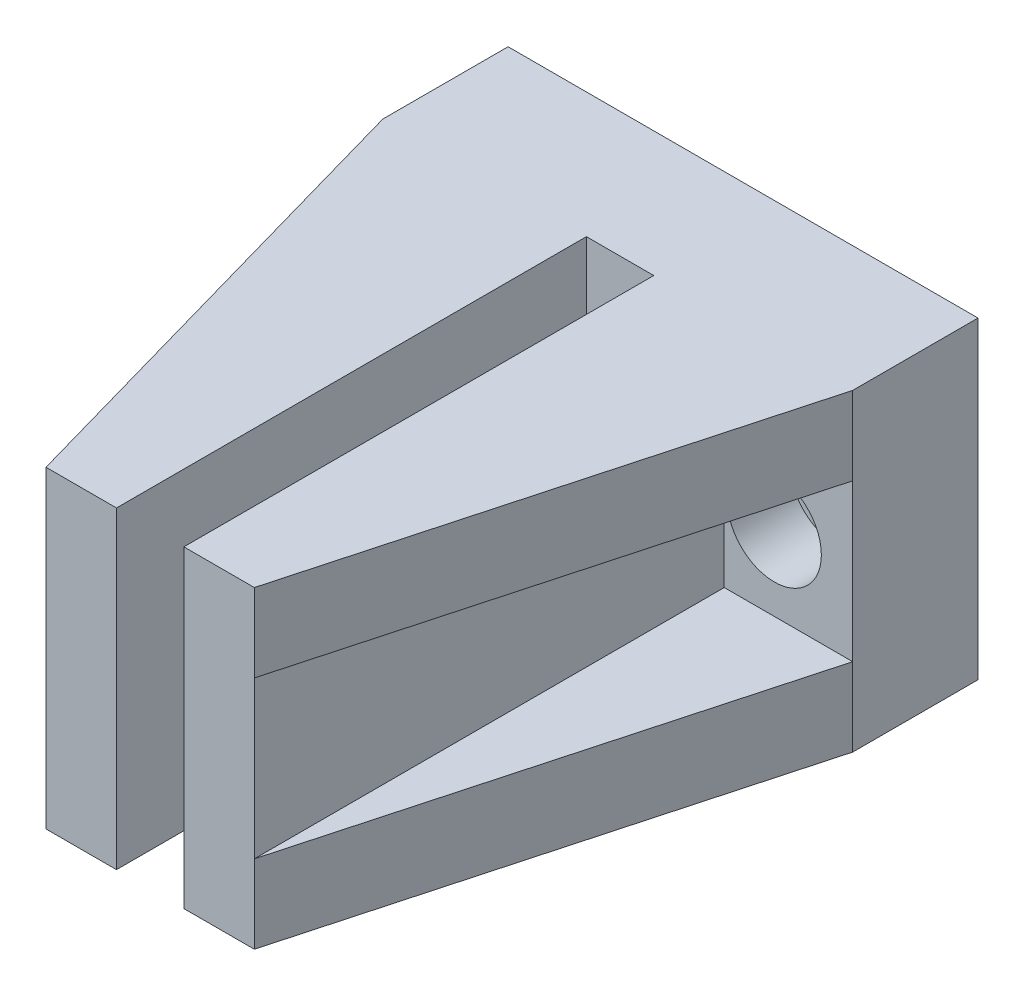
ISO-10303-21;
HEADER;
FILE_DESCRIPTION(('STEP AP214'),'2;1');
FILE_NAME('part.step','',(''),(''),'','','');
FILE_SCHEMA(('AUTOMOTIVE_DESIGN { 1 0 10303 214 1 1 1 1 }'));
ENDSEC;
DATA;
#1=APPLICATION_CONTEXT('core data for automotive mechanical design processes');
#2=APPLICATION_PROTOCOL_DEFINITION('international standard','automotive_design',2000,#1);
#3=PRODUCT_CONTEXT('',#1,'mechanical');
#4=PRODUCT('Part','Part','',(#3));
#5=PRODUCT_RELATED_PRODUCT_CATEGORY('part','',(#4));
#6=PRODUCT_DEFINITION_FORMATION('','',#4);
#7=PRODUCT_DEFINITION_CONTEXT('part definition',#1,'design');
#8=PRODUCT_DEFINITION('design','',#6,#7);
#9=PRODUCT_DEFINITION_SHAPE('','',#8);
#10=(LENGTH_UNIT() NAMED_UNIT(*) SI_UNIT(.MILLI.,.METRE.));
#11=(NAMED_UNIT(*) PLANE_ANGLE_UNIT() SI_UNIT($,.RADIAN.));
#12=(NAMED_UNIT(*) SI_UNIT($,.STERADIAN.) SOLID_ANGLE_UNIT());
#13=UNCERTAINTY_MEASURE_WITH_UNIT(LENGTH_MEASURE(1.E-05),#10,'distance_accuracy_value','');
#14=(GEOMETRIC_REPRESENTATION_CONTEXT(3) GLOBAL_UNCERTAINTY_ASSIGNED_CONTEXT((#13)) GLOBAL_UNIT_ASSIGNED_CONTEXT((#10,
#11,#12)) REPRESENTATION_CONTEXT('',''));
#15=CARTESIAN_POINT('',(0.,0.,0.));
#16=DIRECTION('',(0.,0.,1.));
#17=DIRECTION('',(1.,0.,0.));
#18=AXIS2_PLACEMENT_3D('',#15,#16,#17);
#19=CARTESIAN_POINT('',(-10.,0.,8.));
#20=DIRECTION('',(0.,0.,-1.));
#21=DIRECTION('',(-1.,0.,0.));
#22=AXIS2_PLACEMENT_3D('',#19,#20,#21);
#23=CYLINDRICAL_SURFACE('',#22,1.65);
#24=CARTESIAN_POINT('',(-10.,0.,0.));
#25=DIRECTION('',(0.,0.,1.));
#26=DIRECTION('',(1.,0.,0.));
#27=AXIS2_PLACEMENT_3D('',#24,#25,#26);
#28=CIRCLE('',#27,1.65);
#29=CARTESIAN_POINT('',(-8.35,0.,0.));
#30=VERTEX_POINT('',#29);
#31=EDGE_CURVE('E229',#30,#30,#28,.T.);
#32=ORIENTED_EDGE('',*,*,#31,.F.);
#33=EDGE_LOOP('',(#32));
#34=FACE_BOUND('',#33,.T.);
#35=CARTESIAN_POINT('',(-10.,0.,4.));
#36=DIRECTION('',(0.,0.,1.));
#37=DIRECTION('',(1.,0.,0.));
#38=AXIS2_PLACEMENT_3D('',#35,#36,#37);
#39=CIRCLE('',#38,1.65);
#40=CARTESIAN_POINT('',(-8.35,0.,4.));
#41=VERTEX_POINT('',#40);
#42=EDGE_CURVE('E55',#41,#41,#39,.T.);
#43=ORIENTED_EDGE('',*,*,#42,.T.);
#44=EDGE_LOOP('',(#43));
#45=FACE_BOUND('',#44,.T.);
#46=ADVANCED_FACE('F51',(#34,#45),#23,.F.);
#47=CARTESIAN_POINT('',(9.99977818883572,-0.0941934040751369,8.));
#48=DIRECTION('',(0.,0.,-1.));
#49=DIRECTION('',(-1.,0.,0.));
#50=AXIS2_PLACEMENT_3D('',#47,#48,#49);
#51=CYLINDRICAL_SURFACE('',#50,1.65);
#52=CARTESIAN_POINT('',(9.99977818883572,-0.0941934040751369,0.));
#53=DIRECTION('',(0.,0.,1.));
#54=DIRECTION('',(1.,0.,0.));
#55=AXIS2_PLACEMENT_3D('',#52,#53,#54);
#56=CIRCLE('',#55,1.65);
#57=CARTESIAN_POINT('',(11.6497781888357,-0.0941934040751369,0.));
#58=VERTEX_POINT('',#57);
#59=EDGE_CURVE('E225',#58,#58,#56,.T.);
#60=ORIENTED_EDGE('',*,*,#59,.F.);
#61=EDGE_LOOP('',(#60));
#62=FACE_BOUND('',#61,.T.);
#63=CARTESIAN_POINT('',(9.99977818883572,-0.0941934040751369,4.));
#64=DIRECTION('',(0.,0.,1.));
#65=DIRECTION('',(1.,0.,0.));
#66=AXIS2_PLACEMENT_3D('',#63,#64,#65);
#67=CIRCLE('',#66,1.65);
#68=CARTESIAN_POINT('',(11.6497781888357,-0.0941934040751369,4.));
#69=VERTEX_POINT('',#68);
#70=EDGE_CURVE('E280',#69,#69,#67,.T.);
#71=ORIENTED_EDGE('',*,*,#70,.T.);
#72=EDGE_LOOP('',(#71));
#73=FACE_BOUND('',#72,.T.);
#74=ADVANCED_FACE('F417',(#62,#73),#51,.F.);
#75=CARTESIAN_POINT('',(-15.,-41.1809236553377,8.));
#76=DIRECTION('',(-0.962126726315384,0.,0.272602572456025));
#77=DIRECTION('',(0.272602572456025,0.,0.962126726315384));
#78=AXIS2_PLACEMENT_3D('',#75,#76,#77);
#79=PLANE('',#78);
#80=DIRECTION('',(0.272602572456025,0.,0.962126726315384));
#81=VECTOR('',#80,1.);
#82=CARTESIAN_POINT('',(-15.,-5.,8.));
#83=LINE('',#82,#81);
#84=CARTESIAN_POINT('',(-15.,-5.,8.));
#85=VERTEX_POINT('',#84);
#86=CARTESIAN_POINT('',(-6.5,-5.,38.));
#87=VERTEX_POINT('',#86);
#88=EDGE_CURVE('E12',#85,#87,#83,.T.);
#89=ORIENTED_EDGE('',*,*,#88,.F.);
#90=DIRECTION('',(0.,-1.,0.));
#91=VECTOR('',#90,1.);
#92=CARTESIAN_POINT('',(-15.,-10.,8.));
#93=LINE('',#92,#91);
#94=CARTESIAN_POINT('',(-15.,-10.,8.));
#95=VERTEX_POINT('',#94);
#96=EDGE_CURVE('E237',#85,#95,#93,.T.);
#97=ORIENTED_EDGE('',*,*,#96,.T.);
#98=DIRECTION('',(-0.272602572456025,0.,-0.962126726315384));
#99=VECTOR('',#98,1.);
#100=CARTESIAN_POINT('',(-15.,-10.,8.));
#101=LINE('',#100,#99);
#102=CARTESIAN_POINT('',(-6.5,-9.99999999999999,38.));
#103=VERTEX_POINT('',#102);
#104=EDGE_CURVE('E351',#103,#95,#101,.T.);
#105=ORIENTED_EDGE('',*,*,#104,.F.);
#106=DIRECTION('',(0.,-1.,0.));
#107=VECTOR('',#106,1.);
#108=CARTESIAN_POINT('',(-6.5,-9.99999999999999,38.));
#109=LINE('',#108,#107);
#110=EDGE_CURVE('E203',#87,#103,#109,.T.);
#111=ORIENTED_EDGE('',*,*,#110,.F.);
#112=EDGE_LOOP('',(#89,#97,#105,#111));
#113=FACE_BOUND('',#112,.T.);
#114=ADVANCED_FACE('F402',(#113),#79,.T.);
#115=CARTESIAN_POINT('',(6.8,-41.1809236553377,38.));
#116=DIRECTION('',(0.964615265436891,0.,0.263661505886084));
#117=DIRECTION('',(0.263661505886084,0.,-0.964615265436891));
#118=AXIS2_PLACEMENT_3D('',#115,#116,#117);
#119=PLANE('',#118);
#120=DIRECTION('',(-0.263661505886084,0.,0.964615265436891));
#121=VECTOR('',#120,1.);
#122=CARTESIAN_POINT('',(6.8,5.,38.));
#123=LINE('',#122,#121);
#124=CARTESIAN_POINT('',(15.,5.,8.));
#125=VERTEX_POINT('',#124);
#126=CARTESIAN_POINT('',(6.8,5.,38.));
#127=VERTEX_POINT('',#126);
#128=EDGE_CURVE('E195',#125,#127,#123,.T.);
#129=ORIENTED_EDGE('',*,*,#128,.F.);
#130=DIRECTION('',(0.,1.,0.));
#131=VECTOR('',#130,1.);
#132=CARTESIAN_POINT('',(15.,-10.,8.));
#133=LINE('',#132,#131);
#134=CARTESIAN_POINT('',(15.,10.,8.));
#135=VERTEX_POINT('',#134);
#136=EDGE_CURVE('E240',#125,#135,#133,.T.);
#137=ORIENTED_EDGE('',*,*,#136,.T.);
#138=DIRECTION('',(0.263661505886084,0.,-0.96461526543689));
#139=VECTOR('',#138,1.);
#140=CARTESIAN_POINT('',(6.8,10.,38.));
#141=LINE('',#140,#139);
#142=CARTESIAN_POINT('',(6.8,10.,38.));
#143=VERTEX_POINT('',#142);
#144=EDGE_CURVE('E342',#143,#135,#141,.T.);
#145=ORIENTED_EDGE('',*,*,#144,.F.);
#146=DIRECTION('',(0.,1.,0.));
#147=VECTOR('',#146,1.);
#148=CARTESIAN_POINT('',(6.8,-10.,38.));
#149=LINE('',#148,#147);
#150=EDGE_CURVE('E377',#127,#143,#149,.T.);
#151=ORIENTED_EDGE('',*,*,#150,.F.);
#152=EDGE_LOOP('',(#129,#137,#145,#151));
#153=FACE_BOUND('',#152,.T.);
#154=ADVANCED_FACE('F433',(#153),#119,.T.);
#155=CARTESIAN_POINT('',(0.,0.,8.));
#156=DIRECTION('',(0.,0.,1.));
#157=DIRECTION('',(1.,0.,0.));
#158=AXIS2_PLACEMENT_3D('',#155,#156,#157);
#159=PLANE('',#158);
#160=DIRECTION('',(1.,0.,0.));
#161=VECTOR('',#160,1.);
#162=CARTESIAN_POINT('',(15.,-10.,8.));
#163=LINE('',#162,#161);
#164=CARTESIAN_POINT('',(-2.,-10.,8.));
#165=VERTEX_POINT('',#164);
#166=CARTESIAN_POINT('',(2.3,-10.,8.));
#167=VERTEX_POINT('',#166);
#168=EDGE_CURVE('E236',#165,#167,#163,.T.);
#169=ORIENTED_EDGE('',*,*,#168,.T.);
#170=DIRECTION('',(0.,-1.,0.));
#171=VECTOR('',#170,1.);
#172=CARTESIAN_POINT('',(2.3,-10.,8.));
#173=LINE('',#172,#171);
#174=CARTESIAN_POINT('',(2.3,10.,8.));
#175=VERTEX_POINT('',#174);
#176=EDGE_CURVE('E217',#175,#167,#173,.T.);
#177=ORIENTED_EDGE('',*,*,#176,.F.);
#178=DIRECTION('',(-1.,0.,0.));
#179=VECTOR('',#178,1.);
#180=CARTESIAN_POINT('',(15.,10.,8.));
#181=LINE('',#180,#179);
#182=CARTESIAN_POINT('',(-2.,10.,8.));
#183=VERTEX_POINT('',#182);
#184=EDGE_CURVE('E245',#175,#183,#181,.T.);
#185=ORIENTED_EDGE('',*,*,#184,.T.);
#186=DIRECTION('',(0.,1.,0.));
#187=VECTOR('',#186,1.);
#188=CARTESIAN_POINT('',(-2.,-9.99999999999999,8.));
#189=LINE('',#188,#187);
#190=EDGE_CURVE('E212',#165,#183,#189,.T.);
#191=ORIENTED_EDGE('',*,*,#190,.F.);
#192=EDGE_LOOP('',(#169,#177,#185,#191));
#193=FACE_BOUND('',#192,.T.);
#194=ADVANCED_FACE('F429',(#193),#159,.T.);
#195=CARTESIAN_POINT('',(0.,0.,0.));
#196=DIRECTION('',(0.,0.,1.));
#197=DIRECTION('',(1.,0.,0.));
#198=AXIS2_PLACEMENT_3D('',#195,#196,#197);
#199=PLANE('',#198);
#200=DIRECTION('',(0.,-1.,0.));
#201=VECTOR('',#200,1.);
#202=CARTESIAN_POINT('',(-15.,-10.,0.));
#203=LINE('',#202,#201);
#204=CARTESIAN_POINT('',(-15.,10.,0.));
#205=VERTEX_POINT('',#204);
#206=CARTESIAN_POINT('',(-15.,-10.,0.));
#207=VERTEX_POINT('',#206);
#208=EDGE_CURVE('E233',#205,#207,#203,.T.);
#209=ORIENTED_EDGE('',*,*,#208,.F.);
#210=DIRECTION('',(-1.,0.,0.));
#211=VECTOR('',#210,1.);
#212=CARTESIAN_POINT('',(15.,10.,0.));
#213=LINE('',#212,#211);
#214=CARTESIAN_POINT('',(15.,10.,0.));
#215=VERTEX_POINT('',#214);
#216=EDGE_CURVE('E258',#215,#205,#213,.T.);
#217=ORIENTED_EDGE('',*,*,#216,.F.);
#218=DIRECTION('',(0.,1.,0.));
#219=VECTOR('',#218,1.);
#220=CARTESIAN_POINT('',(15.,-10.,0.));
#221=LINE('',#220,#219);
#222=CARTESIAN_POINT('',(15.,-10.,0.));
#223=VERTEX_POINT('',#222);
#224=EDGE_CURVE('E255',#223,#215,#221,.T.);
#225=ORIENTED_EDGE('',*,*,#224,.F.);
#226=DIRECTION('',(1.,0.,0.));
#227=VECTOR('',#226,1.);
#228=CARTESIAN_POINT('',(15.,-10.,0.));
#229=LINE('',#228,#227);
#230=EDGE_CURVE('E252',#207,#223,#229,.T.);
#231=ORIENTED_EDGE('',*,*,#230,.F.);
#232=EDGE_LOOP('',(#209,#217,#225,#231));
#233=FACE_BOUND('',#232,.T.);
#234=ORIENTED_EDGE('',*,*,#31,.T.);
#235=EDGE_LOOP('',(#234));
#236=FACE_BOUND('',#235,.T.);
#237=ORIENTED_EDGE('',*,*,#59,.T.);
#238=EDGE_LOOP('',(#237));
#239=FACE_BOUND('',#238,.T.);
#240=ADVANCED_FACE('F432',(#233,#236,#239),#199,.F.);
#241=CARTESIAN_POINT('',(-15.,-10.,8.));
#242=DIRECTION('',(1.,0.,0.));
#243=DIRECTION('',(0.,0.,-1.));
#244=AXIS2_PLACEMENT_3D('',#241,#242,#243);
#245=PLANE('',#244);
#246=ORIENTED_EDGE('',*,*,#208,.T.);
#247=DIRECTION('',(0.,0.,-1.));
#248=VECTOR('',#247,1.);
#249=CARTESIAN_POINT('',(-15.,-10.,8.));
#250=LINE('',#249,#248);
#251=EDGE_CURVE('E272',#95,#207,#250,.T.);
#252=ORIENTED_EDGE('',*,*,#251,.F.);
#253=ORIENTED_EDGE('',*,*,#96,.F.);
#254=DIRECTION('',(0.,1.,0.));
#255=VECTOR('',#254,1.);
#256=CARTESIAN_POINT('',(-15.,5.,8.));
#257=LINE('',#256,#255);
#258=CARTESIAN_POINT('',(-15.,5.,8.));
#259=VERTEX_POINT('',#258);
#260=EDGE_CURVE('E306',#85,#259,#257,.T.);
#261=ORIENTED_EDGE('',*,*,#260,.T.);
#262=CARTESIAN_POINT('',(-15.,10.,8.));
#263=VERTEX_POINT('',#262);
#264=EDGE_CURVE('E193',#263,#259,#93,.T.);
#265=ORIENTED_EDGE('',*,*,#264,.F.);
#266=DIRECTION('',(0.,0.,-1.));
#267=VECTOR('',#266,1.);
#268=CARTESIAN_POINT('',(-15.,10.,8.));
#269=LINE('',#268,#267);
#270=EDGE_CURVE('E248',#263,#205,#269,.T.);
#271=ORIENTED_EDGE('',*,*,#270,.T.);
#272=EDGE_LOOP('',(#246,#252,#253,#261,#265,#271));
#273=FACE_BOUND('',#272,.T.);
#274=ADVANCED_FACE('F53',(#273),#245,.F.);
#275=CARTESIAN_POINT('',(15.,-10.,8.));
#276=DIRECTION('',(0.,1.,0.));
#277=DIRECTION('',(-1.,0.,0.));
#278=AXIS2_PLACEMENT_3D('',#275,#276,#277);
#279=PLANE('',#278);
#280=DIRECTION('',(0.,0.,-1.));
#281=VECTOR('',#280,1.);
#282=CARTESIAN_POINT('',(15.,-10.,8.));
#283=LINE('',#282,#281);
#284=CARTESIAN_POINT('',(15.,-10.,8.));
#285=VERTEX_POINT('',#284);
#286=EDGE_CURVE('E268',#285,#223,#283,.T.);
#287=ORIENTED_EDGE('',*,*,#286,.F.);
#288=DIRECTION('',(-0.263661505886084,0.,0.964615265436891));
#289=VECTOR('',#288,1.);
#290=CARTESIAN_POINT('',(6.8,-10.,38.));
#291=LINE('',#290,#289);
#292=CARTESIAN_POINT('',(6.8,-10.,38.));
#293=VERTEX_POINT('',#292);
#294=EDGE_CURVE('E319',#285,#293,#291,.T.);
#295=ORIENTED_EDGE('',*,*,#294,.T.);
#296=DIRECTION('',(1.,0.,0.));
#297=VECTOR('',#296,1.);
#298=CARTESIAN_POINT('',(2.3,-10.,38.));
#299=LINE('',#298,#297);
#300=CARTESIAN_POINT('',(2.3,-10.,38.));
#301=VERTEX_POINT('',#300);
#302=EDGE_CURVE('E363',#301,#293,#299,.T.);
#303=ORIENTED_EDGE('',*,*,#302,.F.);
#304=DIRECTION('',(0.,0.,-1.));
#305=VECTOR('',#304,1.);
#306=CARTESIAN_POINT('',(2.3,-10.,38.));
#307=LINE('',#306,#305);
#308=EDGE_CURVE('E359',#301,#167,#307,.T.);
#309=ORIENTED_EDGE('',*,*,#308,.T.);
#310=ORIENTED_EDGE('',*,*,#168,.F.);
#311=DIRECTION('',(0.,0.,-1.));
#312=VECTOR('',#311,1.);
#313=CARTESIAN_POINT('',(-2.,-9.99999999999999,38.));
#314=LINE('',#313,#312);
#315=CARTESIAN_POINT('',(-2.,-9.99999999999999,38.));
#316=VERTEX_POINT('',#315);
#317=EDGE_CURVE('E207',#316,#165,#314,.T.);
#318=ORIENTED_EDGE('',*,*,#317,.F.);
#319=DIRECTION('',(1.,0.,0.));
#320=VECTOR('',#319,1.);
#321=CARTESIAN_POINT('',(-6.5,-9.99999999999999,38.));
#322=LINE('',#321,#320);
#323=EDGE_CURVE('E202',#103,#316,#322,.T.);
#324=ORIENTED_EDGE('',*,*,#323,.F.);
#325=ORIENTED_EDGE('',*,*,#104,.T.);
#326=ORIENTED_EDGE('',*,*,#251,.T.);
#327=ORIENTED_EDGE('',*,*,#230,.T.);
#328=EDGE_LOOP('',(#287,#295,#303,#309,#310,#318,#324,#325,#326,#327));
#329=FACE_BOUND('',#328,.T.);
#330=ADVANCED_FACE('F442',(#329),#279,.F.);
#331=CARTESIAN_POINT('',(15.,-10.,8.));
#332=DIRECTION('',(-1.,0.,0.));
#333=DIRECTION('',(0.,0.,1.));
#334=AXIS2_PLACEMENT_3D('',#331,#332,#333);
#335=PLANE('',#334);
#336=ORIENTED_EDGE('',*,*,#224,.T.);
#337=DIRECTION('',(0.,0.,-1.));
#338=VECTOR('',#337,1.);
#339=CARTESIAN_POINT('',(15.,10.,8.));
#340=LINE('',#339,#338);
#341=EDGE_CURVE('E264',#135,#215,#340,.T.);
#342=ORIENTED_EDGE('',*,*,#341,.F.);
#343=ORIENTED_EDGE('',*,*,#136,.F.);
#344=DIRECTION('',(0.,-1.,0.));
#345=VECTOR('',#344,1.);
#346=CARTESIAN_POINT('',(15.,5.,8.));
#347=LINE('',#346,#345);
#348=CARTESIAN_POINT('',(15.,-5.,8.));
#349=VERTEX_POINT('',#348);
#350=EDGE_CURVE('E330',#125,#349,#347,.T.);
#351=ORIENTED_EDGE('',*,*,#350,.T.);
#352=EDGE_CURVE('E241',#285,#349,#133,.T.);
#353=ORIENTED_EDGE('',*,*,#352,.F.);
#354=ORIENTED_EDGE('',*,*,#286,.T.);
#355=EDGE_LOOP('',(#336,#342,#343,#351,#353,#354));
#356=FACE_BOUND('',#355,.T.);
#357=ADVANCED_FACE('F440',(#356),#335,.F.);
#358=CARTESIAN_POINT('',(15.,10.,8.));
#359=DIRECTION('',(0.,-1.,0.));
#360=DIRECTION('',(1.,0.,0.));
#361=AXIS2_PLACEMENT_3D('',#358,#359,#360);
#362=PLANE('',#361);
#363=ORIENTED_EDGE('',*,*,#270,.F.);
#364=DIRECTION('',(0.272602572456025,0.,0.962126726315384));
#365=VECTOR('',#364,1.);
#366=CARTESIAN_POINT('',(-15.,10.,8.));
#367=LINE('',#366,#365);
#368=CARTESIAN_POINT('',(-6.5,10.,38.));
#369=VERTEX_POINT('',#368);
#370=EDGE_CURVE('E346',#263,#369,#367,.T.);
#371=ORIENTED_EDGE('',*,*,#370,.T.);
#372=DIRECTION('',(-1.,0.,0.));
#373=VECTOR('',#372,1.);
#374=CARTESIAN_POINT('',(-6.5,10.,38.));
#375=LINE('',#374,#373);
#376=CARTESIAN_POINT('',(-2.,10.,38.));
#377=VERTEX_POINT('',#376);
#378=EDGE_CURVE('E200',#377,#369,#375,.T.);
#379=ORIENTED_EDGE('',*,*,#378,.F.);
#380=DIRECTION('',(0.,0.,-1.));
#381=VECTOR('',#380,1.);
#382=CARTESIAN_POINT('',(-2.,10.,38.));
#383=LINE('',#382,#381);
#384=EDGE_CURVE('E221',#377,#183,#383,.T.);
#385=ORIENTED_EDGE('',*,*,#384,.T.);
#386=ORIENTED_EDGE('',*,*,#184,.F.);
#387=DIRECTION('',(0.,0.,-1.));
#388=VECTOR('',#387,1.);
#389=CARTESIAN_POINT('',(2.3,10.,38.));
#390=LINE('',#389,#388);
#391=CARTESIAN_POINT('',(2.3,10.,38.));
#392=VERTEX_POINT('',#391);
#393=EDGE_CURVE('E355',#392,#175,#390,.T.);
#394=ORIENTED_EDGE('',*,*,#393,.F.);
#395=DIRECTION('',(-1.,0.,0.));
#396=VECTOR('',#395,1.);
#397=CARTESIAN_POINT('',(2.3,10.,38.));
#398=LINE('',#397,#396);
#399=EDGE_CURVE('E374',#143,#392,#398,.T.);
#400=ORIENTED_EDGE('',*,*,#399,.F.);
#401=ORIENTED_EDGE('',*,*,#144,.T.);
#402=ORIENTED_EDGE('',*,*,#341,.T.);
#403=ORIENTED_EDGE('',*,*,#216,.T.);
#404=EDGE_LOOP('',(#363,#371,#379,#385,#386,#394,#400,#401,#402,#403));
#405=FACE_BOUND('',#404,.T.);
#406=ADVANCED_FACE('F390',(#405),#362,.F.);
#407=CARTESIAN_POINT('',(-2.,-9.99999999999999,38.));
#408=DIRECTION('',(-1.,0.,0.));
#409=DIRECTION('',(0.,0.,1.));
#410=AXIS2_PLACEMENT_3D('',#407,#408,#409);
#411=PLANE('',#410);
#412=ORIENTED_EDGE('',*,*,#190,.T.);
#413=ORIENTED_EDGE('',*,*,#384,.F.);
#414=DIRECTION('',(0.,1.,0.));
#415=VECTOR('',#414,1.);
#416=CARTESIAN_POINT('',(-2.,-9.99999999999999,38.));
#417=LINE('',#416,#415);
#418=EDGE_CURVE('E216',#316,#377,#417,.T.);
#419=ORIENTED_EDGE('',*,*,#418,.F.);
#420=ORIENTED_EDGE('',*,*,#317,.T.);
#421=EDGE_LOOP('',(#412,#413,#419,#420));
#422=FACE_BOUND('',#421,.T.);
#423=ADVANCED_FACE('F387',(#422),#411,.F.);
#424=CARTESIAN_POINT('',(0.,0.,38.));
#425=DIRECTION('',(0.,0.,-1.));
#426=DIRECTION('',(-1.,0.,0.));
#427=AXIS2_PLACEMENT_3D('',#424,#425,#426);
#428=PLANE('',#427);
#429=ORIENTED_EDGE('',*,*,#418,.T.);
#430=ORIENTED_EDGE('',*,*,#378,.T.);
#431=CARTESIAN_POINT('',(-6.5,5.,38.));
#432=VERTEX_POINT('',#431);
#433=EDGE_CURVE('E190',#369,#432,#109,.T.);
#434=ORIENTED_EDGE('',*,*,#433,.T.);
#435=DIRECTION('',(0.,1.,0.));
#436=VECTOR('',#435,1.);
#437=CARTESIAN_POINT('',(-6.5,5.,38.));
#438=LINE('',#437,#436);
#439=EDGE_CURVE('E175',#87,#432,#438,.T.);
#440=ORIENTED_EDGE('',*,*,#439,.F.);
#441=ORIENTED_EDGE('',*,*,#110,.T.);
#442=ORIENTED_EDGE('',*,*,#323,.T.);
#443=EDGE_LOOP('',(#429,#430,#434,#440,#441,#442));
#444=FACE_BOUND('',#443,.T.);
#445=ADVANCED_FACE('F199',(#444),#428,.F.);
#446=CARTESIAN_POINT('',(2.3,-10.,38.));
#447=DIRECTION('',(1.,0.,0.));
#448=DIRECTION('',(0.,0.,-1.));
#449=AXIS2_PLACEMENT_3D('',#446,#447,#448);
#450=PLANE('',#449);
#451=ORIENTED_EDGE('',*,*,#176,.T.);
#452=ORIENTED_EDGE('',*,*,#308,.F.);
#453=DIRECTION('',(0.,-1.,0.));
#454=VECTOR('',#453,1.);
#455=CARTESIAN_POINT('',(2.3,-10.,38.));
#456=LINE('',#455,#454);
#457=EDGE_CURVE('E371',#392,#301,#456,.T.);
#458=ORIENTED_EDGE('',*,*,#457,.F.);
#459=ORIENTED_EDGE('',*,*,#393,.T.);
#460=EDGE_LOOP('',(#451,#452,#458,#459));
#461=FACE_BOUND('',#460,.T.);
#462=ADVANCED_FACE('F466',(#461),#450,.F.);
#463=CARTESIAN_POINT('',(0.,0.,38.));
#464=DIRECTION('',(0.,0.,-1.));
#465=DIRECTION('',(-1.,0.,0.));
#466=AXIS2_PLACEMENT_3D('',#463,#464,#465);
#467=PLANE('',#466);
#468=CARTESIAN_POINT('',(6.8,-5.,38.));
#469=VERTEX_POINT('',#468);
#470=EDGE_CURVE('E367',#293,#469,#149,.T.);
#471=ORIENTED_EDGE('',*,*,#470,.T.);
#472=DIRECTION('',(0.,-1.,0.));
#473=VECTOR('',#472,1.);
#474=CARTESIAN_POINT('',(6.8,5.,38.));
#475=LINE('',#474,#473);
#476=EDGE_CURVE('E185',#127,#469,#475,.T.);
#477=ORIENTED_EDGE('',*,*,#476,.F.);
#478=ORIENTED_EDGE('',*,*,#150,.T.);
#479=ORIENTED_EDGE('',*,*,#399,.T.);
#480=ORIENTED_EDGE('',*,*,#457,.T.);
#481=ORIENTED_EDGE('',*,*,#302,.T.);
#482=EDGE_LOOP('',(#471,#477,#478,#479,#480,#481));
#483=FACE_BOUND('',#482,.T.);
#484=ADVANCED_FACE('F461',(#483),#467,.F.);
#485=DIRECTION('',(-0.272602572456025,0.,-0.962126726315384));
#486=VECTOR('',#485,1.);
#487=CARTESIAN_POINT('',(-15.,5.,8.));
#488=LINE('',#487,#486);
#489=EDGE_CURVE('E61',#432,#259,#488,.T.);
#490=ORIENTED_EDGE('',*,*,#489,.F.);
#491=ORIENTED_EDGE('',*,*,#433,.F.);
#492=ORIENTED_EDGE('',*,*,#370,.F.);
#493=ORIENTED_EDGE('',*,*,#264,.T.);
#494=EDGE_LOOP('',(#490,#491,#492,#493));
#495=FACE_BOUND('',#494,.T.);
#496=ADVANCED_FACE('F189',(#495),#79,.T.);
#497=DIRECTION('',(0.263661505886084,0.,-0.964615265436891));
#498=VECTOR('',#497,1.);
#499=CARTESIAN_POINT('',(6.8,-5.,38.));
#500=LINE('',#499,#498);
#501=EDGE_CURVE('E276',#469,#349,#500,.T.);
#502=ORIENTED_EDGE('',*,*,#501,.F.);
#503=ORIENTED_EDGE('',*,*,#470,.F.);
#504=ORIENTED_EDGE('',*,*,#294,.F.);
#505=ORIENTED_EDGE('',*,*,#352,.T.);
#506=EDGE_LOOP('',(#502,#503,#504,#505));
#507=FACE_BOUND('',#506,.T.);
#508=ADVANCED_FACE('F458',(#507),#119,.T.);
#509=CARTESIAN_POINT('',(0.,0.,8.));
#510=DIRECTION('',(0.,0.,1.));
#511=DIRECTION('',(1.,0.,0.));
#512=AXIS2_PLACEMENT_3D('',#509,#510,#511);
#513=PLANE('',#512);
#514=CARTESIAN_POINT('',(9.99977818883572,-0.0941934040751369,8.));
#515=DIRECTION('',(0.,0.,1.));
#516=DIRECTION('',(1.,0.,0.));
#517=AXIS2_PLACEMENT_3D('',#514,#515,#516);
#518=CIRCLE('',#517,3.);
#519=CARTESIAN_POINT('',(12.9997781888357,-0.0941934040751369,8.));
#520=VERTEX_POINT('',#519);
#521=EDGE_CURVE('E296',#520,#520,#518,.T.);
#522=ORIENTED_EDGE('',*,*,#521,.F.);
#523=EDGE_LOOP('',(#522));
#524=FACE_BOUND('',#523,.T.);
#525=DIRECTION('',(0.,1.,0.));
#526=VECTOR('',#525,1.);
#527=CARTESIAN_POINT('',(6.8,5.,8.));
#528=LINE('',#527,#526);
#529=CARTESIAN_POINT('',(6.8,-5.,8.));
#530=VERTEX_POINT('',#529);
#531=CARTESIAN_POINT('',(6.8,5.,8.));
#532=VERTEX_POINT('',#531);
#533=EDGE_CURVE('E322',#530,#532,#528,.T.);
#534=ORIENTED_EDGE('',*,*,#533,.F.);
#535=DIRECTION('',(-1.,0.,0.));
#536=VECTOR('',#535,1.);
#537=CARTESIAN_POINT('',(6.8,-5.,8.));
#538=LINE('',#537,#536);
#539=EDGE_CURVE('E77',#349,#530,#538,.T.);
#540=ORIENTED_EDGE('',*,*,#539,.F.);
#541=ORIENTED_EDGE('',*,*,#350,.F.);
#542=DIRECTION('',(1.,0.,0.));
#543=VECTOR('',#542,1.);
#544=CARTESIAN_POINT('',(6.8,5.,8.));
#545=LINE('',#544,#543);
#546=EDGE_CURVE('E336',#532,#125,#545,.T.);
#547=ORIENTED_EDGE('',*,*,#546,.F.);
#548=EDGE_LOOP('',(#534,#540,#541,#547));
#549=FACE_BOUND('',#548,.T.);
#550=ADVANCED_FACE('F486',(#524,#549),#513,.T.);
#551=CARTESIAN_POINT('',(6.8,5.,-5.12440474840669));
#552=DIRECTION('',(-1.,0.,0.));
#553=DIRECTION('',(0.,0.,1.));
#554=AXIS2_PLACEMENT_3D('',#551,#552,#553);
#555=PLANE('',#554);
#556=ORIENTED_EDGE('',*,*,#533,.T.);
#557=DIRECTION('',(0.,0.,1.));
#558=VECTOR('',#557,1.);
#559=CARTESIAN_POINT('',(6.8,5.,-5.12440474840669));
#560=LINE('',#559,#558);
#561=EDGE_CURVE('E326',#532,#127,#560,.T.);
#562=ORIENTED_EDGE('',*,*,#561,.T.);
#563=ORIENTED_EDGE('',*,*,#476,.T.);
#564=DIRECTION('',(0.,0.,1.));
#565=VECTOR('',#564,1.);
#566=CARTESIAN_POINT('',(6.8,-5.,-5.12440474840669));
#567=LINE('',#566,#565);
#568=EDGE_CURVE('E323',#530,#469,#567,.T.);
#569=ORIENTED_EDGE('',*,*,#568,.F.);
#570=EDGE_LOOP('',(#556,#562,#563,#569));
#571=FACE_BOUND('',#570,.T.);
#572=ADVANCED_FACE('F484',(#571),#555,.F.);
#573=CARTESIAN_POINT('',(6.8,5.,-5.12440474840669));
#574=DIRECTION('',(0.,1.,0.));
#575=DIRECTION('',(0.,0.,1.));
#576=AXIS2_PLACEMENT_3D('',#573,#574,#575);
#577=PLANE('',#576);
#578=ORIENTED_EDGE('',*,*,#128,.T.);
#579=ORIENTED_EDGE('',*,*,#561,.F.);
#580=ORIENTED_EDGE('',*,*,#546,.T.);
#581=EDGE_LOOP('',(#578,#579,#580));
#582=FACE_BOUND('',#581,.T.);
#583=ADVANCED_FACE('F481',(#582),#577,.F.);
#584=CARTESIAN_POINT('',(6.8,-5.,-5.12440474840669));
#585=DIRECTION('',(0.,-1.,0.));
#586=DIRECTION('',(0.,0.,-1.));
#587=AXIS2_PLACEMENT_3D('',#584,#585,#586);
#588=PLANE('',#587);
#589=ORIENTED_EDGE('',*,*,#501,.T.);
#590=ORIENTED_EDGE('',*,*,#539,.T.);
#591=ORIENTED_EDGE('',*,*,#568,.T.);
#592=EDGE_LOOP('',(#589,#590,#591));
#593=FACE_BOUND('',#592,.T.);
#594=ADVANCED_FACE('F591',(#593),#588,.F.);
#595=CARTESIAN_POINT('',(0.,0.,8.));
#596=DIRECTION('',(0.,0.,1.));
#597=DIRECTION('',(1.,0.,0.));
#598=AXIS2_PLACEMENT_3D('',#595,#596,#597);
#599=PLANE('',#598);
#600=CARTESIAN_POINT('',(-10.,0.,8.));
#601=DIRECTION('',(0.,0.,1.));
#602=DIRECTION('',(1.,0.,0.));
#603=AXIS2_PLACEMENT_3D('',#600,#601,#602);
#604=CIRCLE('',#603,3.);
#605=CARTESIAN_POINT('',(-7.,0.,8.));
#606=VERTEX_POINT('',#605);
#607=EDGE_CURVE('E290',#606,#606,#604,.T.);
#608=ORIENTED_EDGE('',*,*,#607,.F.);
#609=EDGE_LOOP('',(#608));
#610=FACE_BOUND('',#609,.T.);
#611=DIRECTION('',(0.,-1.,0.));
#612=VECTOR('',#611,1.);
#613=CARTESIAN_POINT('',(-6.5,5.,8.));
#614=LINE('',#613,#612);
#615=CARTESIAN_POINT('',(-6.5,5.,8.));
#616=VERTEX_POINT('',#615);
#617=CARTESIAN_POINT('',(-6.5,-5.,8.));
#618=VERTEX_POINT('',#617);
#619=EDGE_CURVE('E312',#616,#618,#614,.T.);
#620=ORIENTED_EDGE('',*,*,#619,.F.);
#621=DIRECTION('',(1.,0.,0.));
#622=VECTOR('',#621,1.);
#623=CARTESIAN_POINT('',(-6.5,5.,8.));
#624=LINE('',#623,#622);
#625=EDGE_CURVE('E69',#259,#616,#624,.T.);
#626=ORIENTED_EDGE('',*,*,#625,.F.);
#627=ORIENTED_EDGE('',*,*,#260,.F.);
#628=DIRECTION('',(-1.,0.,0.));
#629=VECTOR('',#628,1.);
#630=CARTESIAN_POINT('',(-6.5,-5.,8.));
#631=LINE('',#630,#629);
#632=EDGE_CURVE('E309',#618,#85,#631,.T.);
#633=ORIENTED_EDGE('',*,*,#632,.F.);
#634=EDGE_LOOP('',(#620,#626,#627,#633));
#635=FACE_BOUND('',#634,.T.);
#636=ADVANCED_FACE('F400',(#610,#635),#599,.T.);
#637=CARTESIAN_POINT('',(-6.5,5.,-5.12440474840669));
#638=DIRECTION('',(1.,0.,0.));
#639=DIRECTION('',(0.,0.,-1.));
#640=AXIS2_PLACEMENT_3D('',#637,#638,#639);
#641=PLANE('',#640);
#642=ORIENTED_EDGE('',*,*,#619,.T.);
#643=DIRECTION('',(0.,0.,1.));
#644=VECTOR('',#643,1.);
#645=CARTESIAN_POINT('',(-6.5,-5.,-5.12440474840669));
#646=LINE('',#645,#644);
#647=EDGE_CURVE('E174',#618,#87,#646,.T.);
#648=ORIENTED_EDGE('',*,*,#647,.T.);
#649=ORIENTED_EDGE('',*,*,#439,.T.);
#650=DIRECTION('',(0.,0.,1.));
#651=VECTOR('',#650,1.);
#652=CARTESIAN_POINT('',(-6.5,5.,-5.12440474840669));
#653=LINE('',#652,#651);
#654=EDGE_CURVE('E167',#616,#432,#653,.T.);
#655=ORIENTED_EDGE('',*,*,#654,.F.);
#656=EDGE_LOOP('',(#642,#648,#649,#655));
#657=FACE_BOUND('',#656,.T.);
#658=ADVANCED_FACE('F179',(#657),#641,.F.);
#659=CARTESIAN_POINT('',(-6.5,-5.,-5.12440474840669));
#660=DIRECTION('',(0.,-1.,0.));
#661=DIRECTION('',(1.,0.,0.));
#662=AXIS2_PLACEMENT_3D('',#659,#660,#661);
#663=PLANE('',#662);
#664=ORIENTED_EDGE('',*,*,#88,.T.);
#665=ORIENTED_EDGE('',*,*,#647,.F.);
#666=ORIENTED_EDGE('',*,*,#632,.T.);
#667=EDGE_LOOP('',(#664,#665,#666));
#668=FACE_BOUND('',#667,.T.);
#669=ADVANCED_FACE('F405',(#668),#663,.F.);
#670=CARTESIAN_POINT('',(-6.5,5.,-5.12440474840669));
#671=DIRECTION('',(0.,1.,0.));
#672=DIRECTION('',(-1.,0.,0.));
#673=AXIS2_PLACEMENT_3D('',#670,#671,#672);
#674=PLANE('',#673);
#675=ORIENTED_EDGE('',*,*,#489,.T.);
#676=ORIENTED_EDGE('',*,*,#625,.T.);
#677=ORIENTED_EDGE('',*,*,#654,.T.);
#678=EDGE_LOOP('',(#675,#676,#677));
#679=FACE_BOUND('',#678,.T.);
#680=ADVANCED_FACE('F169',(#679),#674,.F.);
#681=CARTESIAN_POINT('',(-10.,0.,4.));
#682=DIRECTION('',(0.,0.,1.));
#683=DIRECTION('',(1.,0.,0.));
#684=AXIS2_PLACEMENT_3D('',#681,#682,#683);
#685=CYLINDRICAL_SURFACE('',#684,3.);
#686=CARTESIAN_POINT('',(-10.,0.,4.));
#687=DIRECTION('',(0.,0.,1.));
#688=DIRECTION('',(1.,0.,0.));
#689=AXIS2_PLACEMENT_3D('',#686,#687,#688);
#690=CIRCLE('',#689,3.);
#691=CARTESIAN_POINT('',(-7.,0.,4.));
#692=VERTEX_POINT('',#691);
#693=EDGE_CURVE('E283',#692,#692,#690,.T.);
#694=ORIENTED_EDGE('',*,*,#693,.F.);
#695=EDGE_LOOP('',(#694));
#696=FACE_BOUND('',#695,.T.);
#697=ORIENTED_EDGE('',*,*,#607,.T.);
#698=EDGE_LOOP('',(#697));
#699=FACE_BOUND('',#698,.T.);
#700=ADVANCED_FACE('F412',(#696,#699),#685,.F.);
#701=CARTESIAN_POINT('',(-10.,0.,4.));
#702=DIRECTION('',(0.,0.,1.));
#703=DIRECTION('',(1.,0.,0.));
#704=AXIS2_PLACEMENT_3D('',#701,#702,#703);
#705=PLANE('',#704);
#706=ORIENTED_EDGE('',*,*,#42,.F.);
#707=EDGE_LOOP('',(#706));
#708=FACE_BOUND('',#707,.T.);
#709=ORIENTED_EDGE('',*,*,#693,.T.);
#710=EDGE_LOOP('',(#709));
#711=FACE_BOUND('',#710,.T.);
#712=ADVANCED_FACE('F639',(#708,#711),#705,.T.);
#713=CARTESIAN_POINT('',(9.99977818883572,-0.0941934040751369,4.));
#714=DIRECTION('',(0.,0.,1.));
#715=DIRECTION('',(1.,0.,0.));
#716=AXIS2_PLACEMENT_3D('',#713,#714,#715);
#717=CYLINDRICAL_SURFACE('',#716,3.);
#718=CARTESIAN_POINT('',(9.99977818883572,-0.0941934040751369,4.));
#719=DIRECTION('',(0.,0.,1.));
#720=DIRECTION('',(1.,0.,0.));
#721=AXIS2_PLACEMENT_3D('',#718,#719,#720);
#722=CIRCLE('',#721,3.);
#723=CARTESIAN_POINT('',(12.9997781888357,-0.0941934040751369,4.));
#724=VERTEX_POINT('',#723);
#725=EDGE_CURVE('E302',#724,#724,#722,.T.);
#726=ORIENTED_EDGE('',*,*,#725,.F.);
#727=EDGE_LOOP('',(#726));
#728=FACE_BOUND('',#727,.T.);
#729=ORIENTED_EDGE('',*,*,#521,.T.);
#730=EDGE_LOOP('',(#729));
#731=FACE_BOUND('',#730,.T.);
#732=ADVANCED_FACE('F649',(#728,#731),#717,.F.);
#733=CARTESIAN_POINT('',(9.99977818883572,-0.0941934040751369,4.));
#734=DIRECTION('',(0.,0.,1.));
#735=DIRECTION('',(1.,0.,0.));
#736=AXIS2_PLACEMENT_3D('',#733,#734,#735);
#737=PLANE('',#736);
#738=ORIENTED_EDGE('',*,*,#70,.F.);
#739=EDGE_LOOP('',(#738));
#740=FACE_BOUND('',#739,.T.);
#741=ORIENTED_EDGE('',*,*,#725,.T.);
#742=EDGE_LOOP('',(#741));
#743=FACE_BOUND('',#742,.T.);
#744=ADVANCED_FACE('F659',(#740,#743),#737,.T.);
#745=CLOSED_SHELL('',(#46,#74,#114,#154,#194,#240,#274,#330,#357,#406,#423,#445,#462,#484,#496,
#508,#550,#572,#583,#594,#636,#658,#669,#680,#700,#712,#732,#744));
#746=MANIFOLD_SOLID_BREP('B2',#745);
#747=ADVANCED_BREP_SHAPE_REPRESENTATION('',(#18,#746),#14);
#748=SHAPE_DEFINITION_REPRESENTATION(#9,#747);
ENDSEC;
END-ISO-10303-21;
